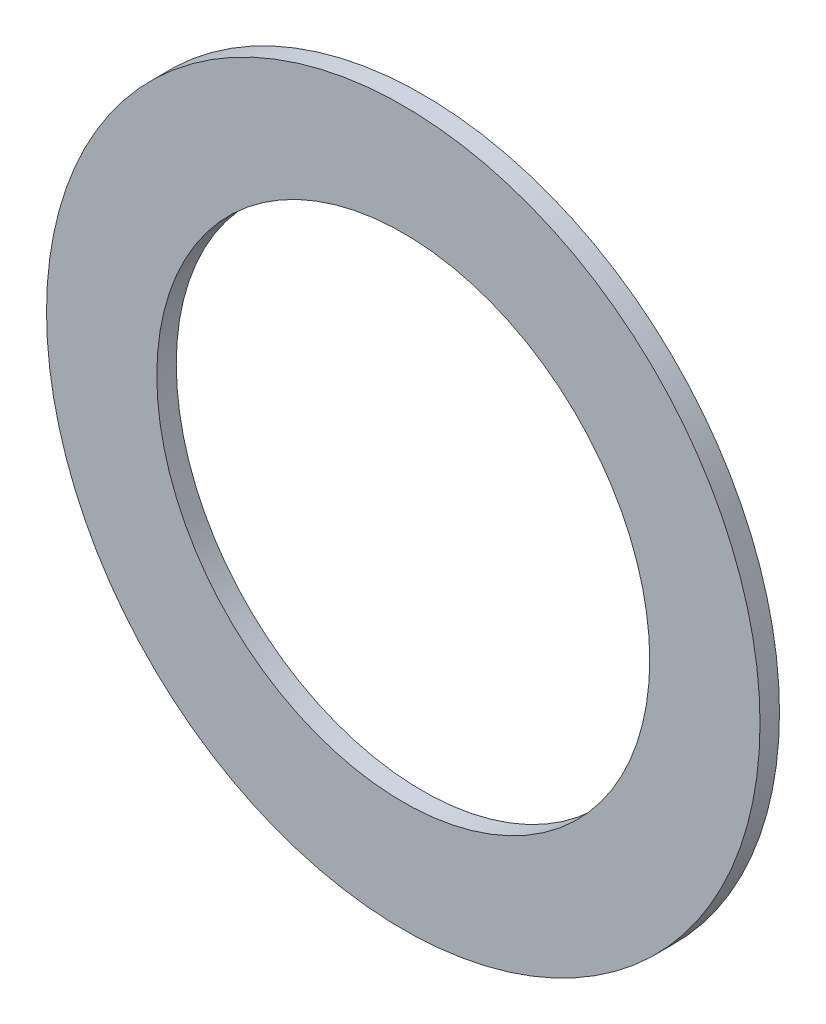
ISO-10303-21;
HEADER;
FILE_DESCRIPTION(('STEP AP214'),'2;1');
FILE_NAME('part.step','',(''),(''),'','','');
FILE_SCHEMA(('AUTOMOTIVE_DESIGN { 1 0 10303 214 1 1 1 1 }'));
ENDSEC;
DATA;
#1=APPLICATION_CONTEXT('core data for automotive mechanical design processes');
#2=APPLICATION_PROTOCOL_DEFINITION('international standard','automotive_design',2000,#1);
#3=PRODUCT_CONTEXT('',#1,'mechanical');
#4=PRODUCT('Part','Part','',(#3));
#5=PRODUCT_RELATED_PRODUCT_CATEGORY('part','',(#4));
#6=PRODUCT_DEFINITION_FORMATION('','',#4);
#7=PRODUCT_DEFINITION_CONTEXT('part definition',#1,'design');
#8=PRODUCT_DEFINITION('design','',#6,#7);
#9=PRODUCT_DEFINITION_SHAPE('','',#8);
#10=(LENGTH_UNIT() NAMED_UNIT(*) SI_UNIT(.MILLI.,.METRE.));
#11=(NAMED_UNIT(*) PLANE_ANGLE_UNIT() SI_UNIT($,.RADIAN.));
#12=(NAMED_UNIT(*) SI_UNIT($,.STERADIAN.) SOLID_ANGLE_UNIT());
#13=UNCERTAINTY_MEASURE_WITH_UNIT(LENGTH_MEASURE(1.E-05),#10,'distance_accuracy_value','');
#14=(GEOMETRIC_REPRESENTATION_CONTEXT(3) GLOBAL_UNCERTAINTY_ASSIGNED_CONTEXT((#13)) GLOBAL_UNIT_ASSIGNED_CONTEXT((#10,
#11,#12)) REPRESENTATION_CONTEXT('',''));
#15=CARTESIAN_POINT('',(0.,0.,0.));
#16=DIRECTION('',(0.,0.,1.));
#17=DIRECTION('',(1.,0.,0.));
#18=AXIS2_PLACEMENT_3D('',#15,#16,#17);
#19=CARTESIAN_POINT('',(0.,0.,0.75));
#20=DIRECTION('',(0.,0.,1.));
#21=DIRECTION('',(1.,0.,0.));
#22=AXIS2_PLACEMENT_3D('',#19,#20,#21);
#23=PLANE('',#22);
#24=CARTESIAN_POINT('',(0.,0.,0.75));
#25=DIRECTION('',(0.,0.,1.));
#26=DIRECTION('',(1.,0.,0.));
#27=AXIS2_PLACEMENT_3D('',#24,#25,#26);
#28=CIRCLE('',#27,27.5);
#29=CARTESIAN_POINT('',(27.5,0.,0.75));
#30=VERTEX_POINT('',#29);
#31=EDGE_CURVE('E10',#30,#30,#28,.T.);
#32=ORIENTED_EDGE('',*,*,#31,.T.);
#33=EDGE_LOOP('',(#32));
#34=FACE_BOUND('',#33,.T.);
#35=CARTESIAN_POINT('',(0.,0.,0.75));
#36=DIRECTION('',(0.,0.,1.));
#37=DIRECTION('',(1.,0.,0.));
#38=AXIS2_PLACEMENT_3D('',#35,#36,#37);
#39=CIRCLE('',#38,19.);
#40=CARTESIAN_POINT('',(19.,0.,0.75));
#41=VERTEX_POINT('',#40);
#42=EDGE_CURVE('E56',#41,#41,#39,.T.);
#43=ORIENTED_EDGE('',*,*,#42,.F.);
#44=EDGE_LOOP('',(#43));
#45=FACE_BOUND('',#44,.T.);
#46=ADVANCED_FACE('F43',(#34,#45),#23,.T.);
#47=CARTESIAN_POINT('',(0.,0.,-0.75));
#48=DIRECTION('',(0.,0.,1.));
#49=DIRECTION('',(1.,0.,0.));
#50=AXIS2_PLACEMENT_3D('',#47,#48,#49);
#51=PLANE('',#50);
#52=CARTESIAN_POINT('',(0.,0.,-0.75));
#53=DIRECTION('',(0.,0.,1.));
#54=DIRECTION('',(1.,0.,0.));
#55=AXIS2_PLACEMENT_3D('',#52,#53,#54);
#56=CIRCLE('',#55,27.5);
#57=CARTESIAN_POINT('',(27.5,0.,-0.75));
#58=VERTEX_POINT('',#57);
#59=EDGE_CURVE('E47',#58,#58,#56,.T.);
#60=ORIENTED_EDGE('',*,*,#59,.F.);
#61=EDGE_LOOP('',(#60));
#62=FACE_BOUND('',#61,.T.);
#63=CARTESIAN_POINT('',(0.,0.,-0.75));
#64=DIRECTION('',(0.,0.,1.));
#65=DIRECTION('',(1.,0.,0.));
#66=AXIS2_PLACEMENT_3D('',#63,#64,#65);
#67=CIRCLE('',#66,19.);
#68=CARTESIAN_POINT('',(19.,0.,-0.75));
#69=VERTEX_POINT('',#68);
#70=EDGE_CURVE('E58',#69,#69,#67,.T.);
#71=ORIENTED_EDGE('',*,*,#70,.T.);
#72=EDGE_LOOP('',(#71));
#73=FACE_BOUND('',#72,.T.);
#74=ADVANCED_FACE('F70',(#62,#73),#51,.F.);
#75=CARTESIAN_POINT('',(0.,0.,0.75));
#76=DIRECTION('',(0.,0.,-1.));
#77=DIRECTION('',(-1.,0.,0.));
#78=AXIS2_PLACEMENT_3D('',#75,#76,#77);
#79=CYLINDRICAL_SURFACE('',#78,27.5);
#80=ORIENTED_EDGE('',*,*,#31,.F.);
#81=EDGE_LOOP('',(#80));
#82=FACE_BOUND('',#81,.T.);
#83=ORIENTED_EDGE('',*,*,#59,.T.);
#84=EDGE_LOOP('',(#83));
#85=FACE_BOUND('',#84,.T.);
#86=ADVANCED_FACE('F45',(#82,#85),#79,.T.);
#87=CARTESIAN_POINT('',(0.,0.,0.75));
#88=DIRECTION('',(0.,0.,-1.));
#89=DIRECTION('',(-1.,0.,0.));
#90=AXIS2_PLACEMENT_3D('',#87,#88,#89);
#91=CYLINDRICAL_SURFACE('',#90,19.);
#92=ORIENTED_EDGE('',*,*,#42,.T.);
#93=EDGE_LOOP('',(#92));
#94=FACE_BOUND('',#93,.T.);
#95=ORIENTED_EDGE('',*,*,#70,.F.);
#96=EDGE_LOOP('',(#95));
#97=FACE_BOUND('',#96,.T.);
#98=ADVANCED_FACE('F66',(#94,#97),#91,.F.);
#99=CLOSED_SHELL('',(#46,#74,#86,#98));
#100=MANIFOLD_SOLID_BREP('B2',#99);
#101=ADVANCED_BREP_SHAPE_REPRESENTATION('',(#18,#100),#14);
#102=SHAPE_DEFINITION_REPRESENTATION(#9,#101);
ENDSEC;
END-ISO-10303-21;
